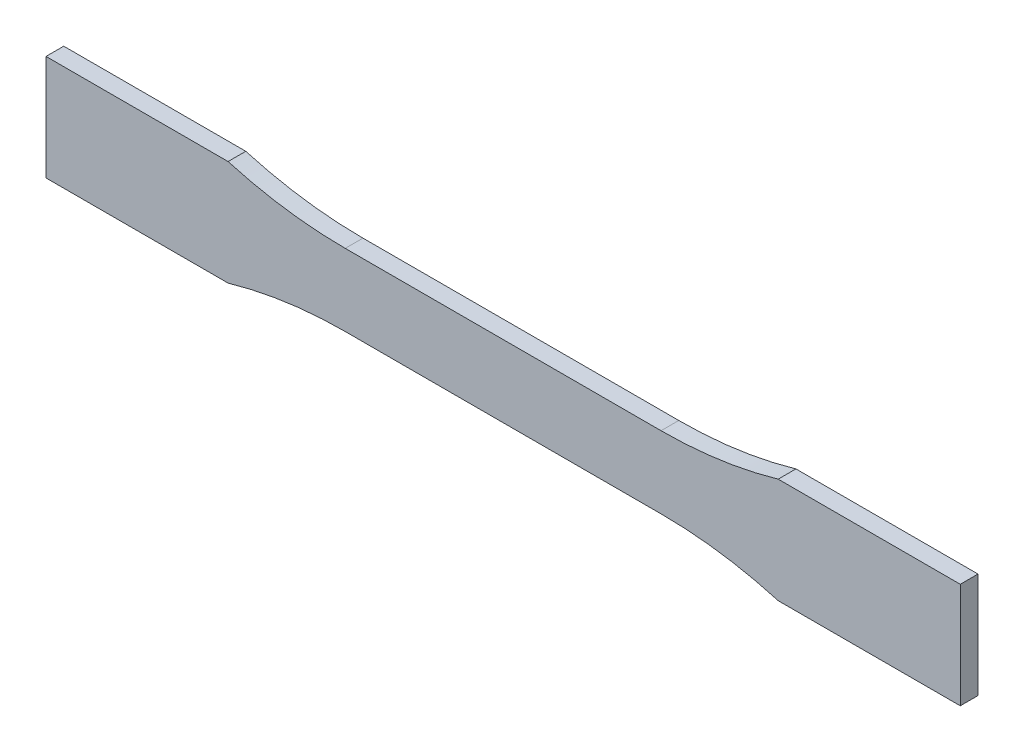
ISO-10303-21;
HEADER;
FILE_DESCRIPTION(('STEP AP214'),'2;1');
FILE_NAME('part.step','',(''),(''),'','','');
FILE_SCHEMA(('AUTOMOTIVE_DESIGN { 1 0 10303 214 1 1 1 1 }'));
ENDSEC;
DATA;
#1=APPLICATION_CONTEXT('core data for automotive mechanical design processes');
#2=APPLICATION_PROTOCOL_DEFINITION('international standard','automotive_design',2000,#1);
#3=PRODUCT_CONTEXT('',#1,'mechanical');
#4=PRODUCT('Part','Part','',(#3));
#5=PRODUCT_RELATED_PRODUCT_CATEGORY('part','',(#4));
#6=PRODUCT_DEFINITION_FORMATION('','',#4);
#7=PRODUCT_DEFINITION_CONTEXT('part definition',#1,'design');
#8=PRODUCT_DEFINITION('design','',#6,#7);
#9=PRODUCT_DEFINITION_SHAPE('','',#8);
#10=(LENGTH_UNIT() NAMED_UNIT(*) SI_UNIT(.MILLI.,.METRE.));
#11=(NAMED_UNIT(*) PLANE_ANGLE_UNIT() SI_UNIT($,.RADIAN.));
#12=(NAMED_UNIT(*) SI_UNIT($,.STERADIAN.) SOLID_ANGLE_UNIT());
#13=UNCERTAINTY_MEASURE_WITH_UNIT(LENGTH_MEASURE(1.E-05),#10,'distance_accuracy_value','');
#14=(GEOMETRIC_REPRESENTATION_CONTEXT(3) GLOBAL_UNCERTAINTY_ASSIGNED_CONTEXT((#13)) GLOBAL_UNIT_ASSIGNED_CONTEXT((#10,
#11,#12)) REPRESENTATION_CONTEXT('',''));
#15=CARTESIAN_POINT('',(0.,0.,0.));
#16=DIRECTION('',(0.,0.,1.));
#17=DIRECTION('',(1.,0.,0.));
#18=AXIS2_PLACEMENT_3D('',#15,#16,#17);
#19=CARTESIAN_POINT('',(-82.5,9.5,1.6));
#20=DIRECTION('',(0.,-1.,0.));
#21=DIRECTION('',(1.,0.,0.));
#22=AXIS2_PLACEMENT_3D('',#19,#20,#21);
#23=PLANE('',#22);
#24=DIRECTION('',(-1.,0.,0.));
#25=VECTOR('',#24,1.);
#26=CARTESIAN_POINT('',(-82.5,9.5,-1.6));
#27=LINE('',#26,#25);
#28=CARTESIAN_POINT('',(-49.6423745118661,9.50000000000001,-1.6));
#29=VERTEX_POINT('',#28);
#30=CARTESIAN_POINT('',(-82.5,9.5,-1.6));
#31=VERTEX_POINT('',#30);
#32=EDGE_CURVE('E159',#29,#31,#27,.T.);
#33=ORIENTED_EDGE('',*,*,#32,.T.);
#34=DIRECTION('',(0.,0.,-1.));
#35=VECTOR('',#34,1.);
#36=CARTESIAN_POINT('',(-82.5,9.5,1.6));
#37=LINE('',#36,#35);
#38=CARTESIAN_POINT('',(-82.5,9.5,1.6));
#39=VERTEX_POINT('',#38);
#40=EDGE_CURVE('E11',#39,#31,#37,.T.);
#41=ORIENTED_EDGE('',*,*,#40,.F.);
#42=DIRECTION('',(-1.,0.,0.));
#43=VECTOR('',#42,1.);
#44=CARTESIAN_POINT('',(-82.5,9.5,1.6));
#45=LINE('',#44,#43);
#46=CARTESIAN_POINT('',(-49.6423745118661,9.50000000000001,1.6));
#47=VERTEX_POINT('',#46);
#48=EDGE_CURVE('E181',#47,#39,#45,.T.);
#49=ORIENTED_EDGE('',*,*,#48,.F.);
#50=DIRECTION('',(0.,0.,-1.));
#51=VECTOR('',#50,1.);
#52=CARTESIAN_POINT('',(-49.6423745118661,9.50000000000001,1.6));
#53=LINE('',#52,#51);
#54=EDGE_CURVE('E155',#47,#29,#53,.T.);
#55=ORIENTED_EDGE('',*,*,#54,.T.);
#56=EDGE_LOOP('',(#33,#41,#49,#55));
#57=FACE_BOUND('',#56,.T.);
#58=ADVANCED_FACE('F39',(#57),#23,.F.);
#59=CARTESIAN_POINT('',(-82.5,9.5,1.6));
#60=DIRECTION('',(1.,0.,0.));
#61=DIRECTION('',(0.,0.,-1.));
#62=AXIS2_PLACEMENT_3D('',#59,#60,#61);
#63=PLANE('',#62);
#64=DIRECTION('',(0.,-1.,0.));
#65=VECTOR('',#64,1.);
#66=CARTESIAN_POINT('',(-82.5,9.5,-1.6));
#67=LINE('',#66,#65);
#68=CARTESIAN_POINT('',(-82.5,-9.50000000000003,-1.6));
#69=VERTEX_POINT('',#68);
#70=EDGE_CURVE('E162',#31,#69,#67,.T.);
#71=ORIENTED_EDGE('',*,*,#70,.T.);
#72=DIRECTION('',(0.,0.,-1.));
#73=VECTOR('',#72,1.);
#74=CARTESIAN_POINT('',(-82.5,-9.50000000000003,1.6));
#75=LINE('',#74,#73);
#76=CARTESIAN_POINT('',(-82.5,-9.50000000000003,1.6));
#77=VERTEX_POINT('',#76);
#78=EDGE_CURVE('E47',#77,#69,#75,.T.);
#79=ORIENTED_EDGE('',*,*,#78,.F.);
#80=DIRECTION('',(0.,-1.,0.));
#81=VECTOR('',#80,1.);
#82=CARTESIAN_POINT('',(-82.5,9.5,1.6));
#83=LINE('',#82,#81);
#84=EDGE_CURVE('E110',#39,#77,#83,.T.);
#85=ORIENTED_EDGE('',*,*,#84,.F.);
#86=ORIENTED_EDGE('',*,*,#40,.T.);
#87=EDGE_LOOP('',(#71,#79,#85,#86));
#88=FACE_BOUND('',#87,.T.);
#89=ADVANCED_FACE('F259',(#88),#63,.F.);
#90=CARTESIAN_POINT('',(-82.5,-9.50000000000003,1.6));
#91=DIRECTION('',(0.,1.,0.));
#92=DIRECTION('',(-1.,0.,0.));
#93=AXIS2_PLACEMENT_3D('',#90,#91,#92);
#94=PLANE('',#93);
#95=DIRECTION('',(1.,0.,0.));
#96=VECTOR('',#95,1.);
#97=CARTESIAN_POINT('',(-82.5,-9.50000000000003,-1.6));
#98=LINE('',#97,#96);
#99=CARTESIAN_POINT('',(-49.6423745118661,-9.50000000000002,-1.6));
#100=VERTEX_POINT('',#99);
#101=EDGE_CURVE('E164',#69,#100,#98,.T.);
#102=ORIENTED_EDGE('',*,*,#101,.T.);
#103=DIRECTION('',(0.,0.,-1.));
#104=VECTOR('',#103,1.);
#105=CARTESIAN_POINT('',(-49.6423745118661,-9.50000000000002,1.6));
#106=LINE('',#105,#104);
#107=CARTESIAN_POINT('',(-49.6423745118661,-9.50000000000002,1.6));
#108=VERTEX_POINT('',#107);
#109=EDGE_CURVE('E200',#108,#100,#106,.T.);
#110=ORIENTED_EDGE('',*,*,#109,.F.);
#111=DIRECTION('',(1.,0.,0.));
#112=VECTOR('',#111,1.);
#113=CARTESIAN_POINT('',(-82.5,-9.50000000000003,1.6));
#114=LINE('',#113,#112);
#115=EDGE_CURVE('E208',#77,#108,#114,.T.);
#116=ORIENTED_EDGE('',*,*,#115,.F.);
#117=ORIENTED_EDGE('',*,*,#78,.T.);
#118=EDGE_LOOP('',(#102,#110,#116,#117));
#119=FACE_BOUND('',#118,.T.);
#120=ADVANCED_FACE('F206',(#119),#94,.F.);
#121=CARTESIAN_POINT('',(-28.5,-82.4999999999997,1.6));
#122=DIRECTION('',(0.,0.,-1.));
#123=DIRECTION('',(-1.,0.,0.));
#124=AXIS2_PLACEMENT_3D('',#121,#122,#123);
#125=CYLINDRICAL_SURFACE('',#124,75.9999999999997);
#126=CARTESIAN_POINT('',(-28.5,-82.4999999999997,-1.6));
#127=DIRECTION('',(0.,0.,-1.));
#128=DIRECTION('',(1.,0.,0.));
#129=AXIS2_PLACEMENT_3D('',#126,#127,#128);
#130=CIRCLE('',#129,75.9999999999997);
#131=CARTESIAN_POINT('',(-28.5,-6.50000000000001,-1.6));
#132=VERTEX_POINT('',#131);
#133=EDGE_CURVE('E166',#100,#132,#130,.T.);
#134=ORIENTED_EDGE('',*,*,#133,.T.);
#135=DIRECTION('',(0.,0.,-1.));
#136=VECTOR('',#135,1.);
#137=CARTESIAN_POINT('',(-28.5,-6.50000000000001,1.6));
#138=LINE('',#137,#136);
#139=CARTESIAN_POINT('',(-28.5,-6.50000000000001,1.6));
#140=VERTEX_POINT('',#139);
#141=EDGE_CURVE('E197',#140,#132,#138,.T.);
#142=ORIENTED_EDGE('',*,*,#141,.F.);
#143=CARTESIAN_POINT('',(-28.5,-82.4999999999997,1.6));
#144=DIRECTION('',(0.,0.,-1.));
#145=DIRECTION('',(1.,0.,0.));
#146=AXIS2_PLACEMENT_3D('',#143,#144,#145);
#147=CIRCLE('',#146,75.9999999999997);
#148=EDGE_CURVE('E226',#108,#140,#147,.T.);
#149=ORIENTED_EDGE('',*,*,#148,.F.);
#150=ORIENTED_EDGE('',*,*,#109,.T.);
#151=EDGE_LOOP('',(#134,#142,#149,#150));
#152=FACE_BOUND('',#151,.T.);
#153=ADVANCED_FACE('F217',(#152),#125,.F.);
#154=CARTESIAN_POINT('',(-28.5,-6.5,1.6));
#155=DIRECTION('',(0.,1.,0.));
#156=DIRECTION('',(-1.,0.,0.));
#157=AXIS2_PLACEMENT_3D('',#154,#155,#156);
#158=PLANE('',#157);
#159=DIRECTION('',(1.,0.,0.));
#160=VECTOR('',#159,1.);
#161=CARTESIAN_POINT('',(-28.5,-6.5,-1.6));
#162=LINE('',#161,#160);
#163=CARTESIAN_POINT('',(28.5,-6.5,-1.6));
#164=VERTEX_POINT('',#163);
#165=EDGE_CURVE('E168',#132,#164,#162,.T.);
#166=ORIENTED_EDGE('',*,*,#165,.T.);
#167=DIRECTION('',(0.,0.,-1.));
#168=VECTOR('',#167,1.);
#169=CARTESIAN_POINT('',(28.5,-6.5,1.6));
#170=LINE('',#169,#168);
#171=CARTESIAN_POINT('',(28.5,-6.5,1.6));
#172=VERTEX_POINT('',#171);
#173=EDGE_CURVE('E194',#172,#164,#170,.T.);
#174=ORIENTED_EDGE('',*,*,#173,.F.);
#175=DIRECTION('',(1.,0.,0.));
#176=VECTOR('',#175,1.);
#177=CARTESIAN_POINT('',(-28.5,-6.5,1.6));
#178=LINE('',#177,#176);
#179=EDGE_CURVE('E223',#140,#172,#178,.T.);
#180=ORIENTED_EDGE('',*,*,#179,.F.);
#181=ORIENTED_EDGE('',*,*,#141,.T.);
#182=EDGE_LOOP('',(#166,#174,#180,#181));
#183=FACE_BOUND('',#182,.T.);
#184=ADVANCED_FACE('F221',(#183),#158,.F.);
#185=CARTESIAN_POINT('',(28.4999999999999,-82.5000000000002,1.6));
#186=DIRECTION('',(0.,0.,-1.));
#187=DIRECTION('',(-1.,0.,0.));
#188=AXIS2_PLACEMENT_3D('',#185,#186,#187);
#189=CYLINDRICAL_SURFACE('',#188,76.0000000000002);
#190=CARTESIAN_POINT('',(28.4999999999999,-82.5000000000002,-1.6));
#191=DIRECTION('',(0.,0.,-1.));
#192=DIRECTION('',(-1.,0.,0.));
#193=AXIS2_PLACEMENT_3D('',#190,#191,#192);
#194=CIRCLE('',#193,76.0000000000002);
#195=CARTESIAN_POINT('',(49.6423745118659,-9.49999999999999,-1.6));
#196=VERTEX_POINT('',#195);
#197=EDGE_CURVE('E170',#164,#196,#194,.T.);
#198=ORIENTED_EDGE('',*,*,#197,.T.);
#199=DIRECTION('',(0.,0.,-1.));
#200=VECTOR('',#199,1.);
#201=CARTESIAN_POINT('',(49.6423745118659,-9.49999999999999,1.6));
#202=LINE('',#201,#200);
#203=CARTESIAN_POINT('',(49.6423745118659,-9.49999999999999,1.6));
#204=VERTEX_POINT('',#203);
#205=EDGE_CURVE('E191',#204,#196,#202,.T.);
#206=ORIENTED_EDGE('',*,*,#205,.F.);
#207=CARTESIAN_POINT('',(28.4999999999999,-82.5000000000002,1.6));
#208=DIRECTION('',(0.,0.,-1.));
#209=DIRECTION('',(-1.,0.,0.));
#210=AXIS2_PLACEMENT_3D('',#207,#208,#209);
#211=CIRCLE('',#210,76.0000000000002);
#212=EDGE_CURVE('E225',#172,#204,#211,.T.);
#213=ORIENTED_EDGE('',*,*,#212,.F.);
#214=ORIENTED_EDGE('',*,*,#173,.T.);
#215=EDGE_LOOP('',(#198,#206,#213,#214));
#216=FACE_BOUND('',#215,.T.);
#217=ADVANCED_FACE('F272',(#216),#189,.F.);
#218=CARTESIAN_POINT('',(82.5,-9.5,1.6));
#219=DIRECTION('',(0.,1.,0.));
#220=DIRECTION('',(0.,0.,1.));
#221=AXIS2_PLACEMENT_3D('',#218,#219,#220);
#222=PLANE('',#221);
#223=DIRECTION('',(1.,0.,0.));
#224=VECTOR('',#223,1.);
#225=CARTESIAN_POINT('',(82.5,-9.5,-1.6));
#226=LINE('',#225,#224);
#227=CARTESIAN_POINT('',(82.5,-9.5,-1.6));
#228=VERTEX_POINT('',#227);
#229=EDGE_CURVE('E172',#196,#228,#226,.T.);
#230=ORIENTED_EDGE('',*,*,#229,.T.);
#231=DIRECTION('',(0.,0.,-1.));
#232=VECTOR('',#231,1.);
#233=CARTESIAN_POINT('',(82.5,-9.5,1.6));
#234=LINE('',#233,#232);
#235=CARTESIAN_POINT('',(82.5,-9.5,1.6));
#236=VERTEX_POINT('',#235);
#237=EDGE_CURVE('E188',#236,#228,#234,.T.);
#238=ORIENTED_EDGE('',*,*,#237,.F.);
#239=DIRECTION('',(1.,0.,0.));
#240=VECTOR('',#239,1.);
#241=CARTESIAN_POINT('',(82.5,-9.5,1.6));
#242=LINE('',#241,#240);
#243=EDGE_CURVE('E228',#204,#236,#242,.T.);
#244=ORIENTED_EDGE('',*,*,#243,.F.);
#245=ORIENTED_EDGE('',*,*,#205,.T.);
#246=EDGE_LOOP('',(#230,#238,#244,#245));
#247=FACE_BOUND('',#246,.T.);
#248=ADVANCED_FACE('F275',(#247),#222,.F.);
#249=CARTESIAN_POINT('',(82.5,9.5,1.6));
#250=DIRECTION('',(-1.,0.,0.));
#251=DIRECTION('',(0.,-1.,0.));
#252=AXIS2_PLACEMENT_3D('',#249,#250,#251);
#253=PLANE('',#252);
#254=DIRECTION('',(0.,1.,0.));
#255=VECTOR('',#254,1.);
#256=CARTESIAN_POINT('',(82.5,9.5,-1.6));
#257=LINE('',#256,#255);
#258=CARTESIAN_POINT('',(82.5,9.5,-1.6));
#259=VERTEX_POINT('',#258);
#260=EDGE_CURVE('E174',#228,#259,#257,.T.);
#261=ORIENTED_EDGE('',*,*,#260,.T.);
#262=DIRECTION('',(0.,0.,-1.));
#263=VECTOR('',#262,1.);
#264=CARTESIAN_POINT('',(82.5,9.5,1.6));
#265=LINE('',#264,#263);
#266=CARTESIAN_POINT('',(82.5,9.5,1.6));
#267=VERTEX_POINT('',#266);
#268=EDGE_CURVE('E185',#267,#259,#265,.T.);
#269=ORIENTED_EDGE('',*,*,#268,.F.);
#270=DIRECTION('',(0.,1.,0.));
#271=VECTOR('',#270,1.);
#272=CARTESIAN_POINT('',(82.5,9.5,1.6));
#273=LINE('',#272,#271);
#274=EDGE_CURVE('E234',#236,#267,#273,.T.);
#275=ORIENTED_EDGE('',*,*,#274,.F.);
#276=ORIENTED_EDGE('',*,*,#237,.T.);
#277=EDGE_LOOP('',(#261,#269,#275,#276));
#278=FACE_BOUND('',#277,.T.);
#279=ADVANCED_FACE('F240',(#278),#253,.F.);
#280=CARTESIAN_POINT('',(49.6423745118659,9.5,1.6));
#281=DIRECTION('',(0.,-1.,0.));
#282=DIRECTION('',(0.,0.,-1.));
#283=AXIS2_PLACEMENT_3D('',#280,#281,#282);
#284=PLANE('',#283);
#285=DIRECTION('',(-1.,0.,0.));
#286=VECTOR('',#285,1.);
#287=CARTESIAN_POINT('',(49.6423745118659,9.5,-1.6));
#288=LINE('',#287,#286);
#289=CARTESIAN_POINT('',(49.6423745118659,9.5,-1.6));
#290=VERTEX_POINT('',#289);
#291=EDGE_CURVE('E176',#259,#290,#288,.T.);
#292=ORIENTED_EDGE('',*,*,#291,.T.);
#293=DIRECTION('',(0.,0.,-1.));
#294=VECTOR('',#293,1.);
#295=CARTESIAN_POINT('',(49.6423745118659,9.5,1.6));
#296=LINE('',#295,#294);
#297=CARTESIAN_POINT('',(49.6423745118659,9.5,1.6));
#298=VERTEX_POINT('',#297);
#299=EDGE_CURVE('E150',#298,#290,#296,.T.);
#300=ORIENTED_EDGE('',*,*,#299,.F.);
#301=DIRECTION('',(-1.,0.,0.));
#302=VECTOR('',#301,1.);
#303=CARTESIAN_POINT('',(49.6423745118659,9.5,1.6));
#304=LINE('',#303,#302);
#305=EDGE_CURVE('E141',#267,#298,#304,.T.);
#306=ORIENTED_EDGE('',*,*,#305,.F.);
#307=ORIENTED_EDGE('',*,*,#268,.T.);
#308=EDGE_LOOP('',(#292,#300,#306,#307));
#309=FACE_BOUND('',#308,.T.);
#310=ADVANCED_FACE('F244',(#309),#284,.F.);
#311=CARTESIAN_POINT('',(28.5,82.5,1.6));
#312=DIRECTION('',(0.,0.,-1.));
#313=DIRECTION('',(-1.,0.,0.));
#314=AXIS2_PLACEMENT_3D('',#311,#312,#313);
#315=CYLINDRICAL_SURFACE('',#314,76.);
#316=CARTESIAN_POINT('',(28.5,82.5,-1.6));
#317=DIRECTION('',(0.,0.,-1.));
#318=DIRECTION('',(1.,0.,0.));
#319=AXIS2_PLACEMENT_3D('',#316,#317,#318);
#320=CIRCLE('',#319,76.);
#321=CARTESIAN_POINT('',(28.4999999999999,6.50000000000001,-1.6));
#322=VERTEX_POINT('',#321);
#323=EDGE_CURVE('E149',#290,#322,#320,.T.);
#324=ORIENTED_EDGE('',*,*,#323,.T.);
#325=DIRECTION('',(0.,0.,-1.));
#326=VECTOR('',#325,1.);
#327=CARTESIAN_POINT('',(28.4999999999999,6.50000000000001,1.6));
#328=LINE('',#327,#326);
#329=CARTESIAN_POINT('',(28.4999999999999,6.50000000000001,1.6));
#330=VERTEX_POINT('',#329);
#331=EDGE_CURVE('E146',#330,#322,#328,.T.);
#332=ORIENTED_EDGE('',*,*,#331,.F.);
#333=CARTESIAN_POINT('',(28.5,82.5,1.6));
#334=DIRECTION('',(0.,0.,-1.));
#335=DIRECTION('',(1.,0.,0.));
#336=AXIS2_PLACEMENT_3D('',#333,#334,#335);
#337=CIRCLE('',#336,76.);
#338=EDGE_CURVE('E135',#298,#330,#337,.T.);
#339=ORIENTED_EDGE('',*,*,#338,.F.);
#340=ORIENTED_EDGE('',*,*,#299,.T.);
#341=EDGE_LOOP('',(#324,#332,#339,#340));
#342=FACE_BOUND('',#341,.T.);
#343=ADVANCED_FACE('F147',(#342),#315,.F.);
#344=CARTESIAN_POINT('',(-28.5,6.5,1.6));
#345=DIRECTION('',(0.,-1.,0.));
#346=DIRECTION('',(0.,0.,-1.));
#347=AXIS2_PLACEMENT_3D('',#344,#345,#346);
#348=PLANE('',#347);
#349=DIRECTION('',(-1.,0.,0.));
#350=VECTOR('',#349,1.);
#351=CARTESIAN_POINT('',(-28.5,6.5,-1.6));
#352=LINE('',#351,#350);
#353=CARTESIAN_POINT('',(-28.5,6.5,-1.6));
#354=VERTEX_POINT('',#353);
#355=EDGE_CURVE('E96',#322,#354,#352,.T.);
#356=ORIENTED_EDGE('',*,*,#355,.T.);
#357=DIRECTION('',(0.,0.,-1.));
#358=VECTOR('',#357,1.);
#359=CARTESIAN_POINT('',(-28.5,6.5,1.6));
#360=LINE('',#359,#358);
#361=CARTESIAN_POINT('',(-28.5,6.5,1.6));
#362=VERTEX_POINT('',#361);
#363=EDGE_CURVE('E151',#362,#354,#360,.T.);
#364=ORIENTED_EDGE('',*,*,#363,.F.);
#365=DIRECTION('',(-1.,0.,0.));
#366=VECTOR('',#365,1.);
#367=CARTESIAN_POINT('',(-28.5,6.5,1.6));
#368=LINE('',#367,#366);
#369=EDGE_CURVE('E139',#330,#362,#368,.T.);
#370=ORIENTED_EDGE('',*,*,#369,.F.);
#371=ORIENTED_EDGE('',*,*,#331,.T.);
#372=EDGE_LOOP('',(#356,#364,#370,#371));
#373=FACE_BOUND('',#372,.T.);
#374=ADVANCED_FACE('F153',(#373),#348,.F.);
#375=CARTESIAN_POINT('',(-28.5,82.5,1.6));
#376=DIRECTION('',(0.,0.,-1.));
#377=DIRECTION('',(-1.,0.,0.));
#378=AXIS2_PLACEMENT_3D('',#375,#376,#377);
#379=CYLINDRICAL_SURFACE('',#378,76.);
#380=CARTESIAN_POINT('',(-28.5,82.5,-1.6));
#381=DIRECTION('',(0.,0.,-1.));
#382=DIRECTION('',(-1.,0.,0.));
#383=AXIS2_PLACEMENT_3D('',#380,#381,#382);
#384=CIRCLE('',#383,76.);
#385=EDGE_CURVE('E102',#354,#29,#384,.T.);
#386=ORIENTED_EDGE('',*,*,#385,.T.);
#387=ORIENTED_EDGE('',*,*,#54,.F.);
#388=CARTESIAN_POINT('',(-28.5,82.5,1.6));
#389=DIRECTION('',(0.,0.,-1.));
#390=DIRECTION('',(-1.,0.,0.));
#391=AXIS2_PLACEMENT_3D('',#388,#389,#390);
#392=CIRCLE('',#391,76.);
#393=EDGE_CURVE('E55',#362,#47,#392,.T.);
#394=ORIENTED_EDGE('',*,*,#393,.F.);
#395=ORIENTED_EDGE('',*,*,#363,.T.);
#396=EDGE_LOOP('',(#386,#387,#394,#395));
#397=FACE_BOUND('',#396,.T.);
#398=ADVANCED_FACE('F248',(#397),#379,.F.);
#399=CARTESIAN_POINT('',(-28.5,82.5,1.6));
#400=DIRECTION('',(0.,0.,-1.));
#401=DIRECTION('',(-1.,0.,0.));
#402=AXIS2_PLACEMENT_3D('',#399,#400,#401);
#403=PLANE('',#402);
#404=ORIENTED_EDGE('',*,*,#48,.T.);
#405=ORIENTED_EDGE('',*,*,#84,.T.);
#406=ORIENTED_EDGE('',*,*,#115,.T.);
#407=ORIENTED_EDGE('',*,*,#148,.T.);
#408=ORIENTED_EDGE('',*,*,#179,.T.);
#409=ORIENTED_EDGE('',*,*,#212,.T.);
#410=ORIENTED_EDGE('',*,*,#243,.T.);
#411=ORIENTED_EDGE('',*,*,#274,.T.);
#412=ORIENTED_EDGE('',*,*,#305,.T.);
#413=ORIENTED_EDGE('',*,*,#338,.T.);
#414=ORIENTED_EDGE('',*,*,#369,.T.);
#415=ORIENTED_EDGE('',*,*,#393,.T.);
#416=EDGE_LOOP('',(#404,#405,#406,#407,#408,#409,#410,#411,#412,#413,#414,#415));
#417=FACE_BOUND('',#416,.T.);
#418=ADVANCED_FACE('F137',(#417),#403,.F.);
#419=CARTESIAN_POINT('',(-28.5,82.5,-1.6));
#420=DIRECTION('',(0.,0.,-1.));
#421=DIRECTION('',(-1.,0.,0.));
#422=AXIS2_PLACEMENT_3D('',#419,#420,#421);
#423=PLANE('',#422);
#424=ORIENTED_EDGE('',*,*,#32,.F.);
#425=ORIENTED_EDGE('',*,*,#385,.F.);
#426=ORIENTED_EDGE('',*,*,#355,.F.);
#427=ORIENTED_EDGE('',*,*,#323,.F.);
#428=ORIENTED_EDGE('',*,*,#291,.F.);
#429=ORIENTED_EDGE('',*,*,#260,.F.);
#430=ORIENTED_EDGE('',*,*,#229,.F.);
#431=ORIENTED_EDGE('',*,*,#197,.F.);
#432=ORIENTED_EDGE('',*,*,#165,.F.);
#433=ORIENTED_EDGE('',*,*,#133,.F.);
#434=ORIENTED_EDGE('',*,*,#101,.F.);
#435=ORIENTED_EDGE('',*,*,#70,.F.);
#436=EDGE_LOOP('',(#424,#425,#426,#427,#428,#429,#430,#431,#432,#433,#434,#435));
#437=FACE_BOUND('',#436,.T.);
#438=ADVANCED_FACE('F212',(#437),#423,.T.);
#439=CLOSED_SHELL('',(#58,#89,#120,#153,#184,#217,#248,#279,#310,#343,#374,#398,#418,#438));
#440=MANIFOLD_SOLID_BREP('B2',#439);
#441=ADVANCED_BREP_SHAPE_REPRESENTATION('',(#18,#440),#14);
#442=SHAPE_DEFINITION_REPRESENTATION(#9,#441);
ENDSEC;
END-ISO-10303-21;
